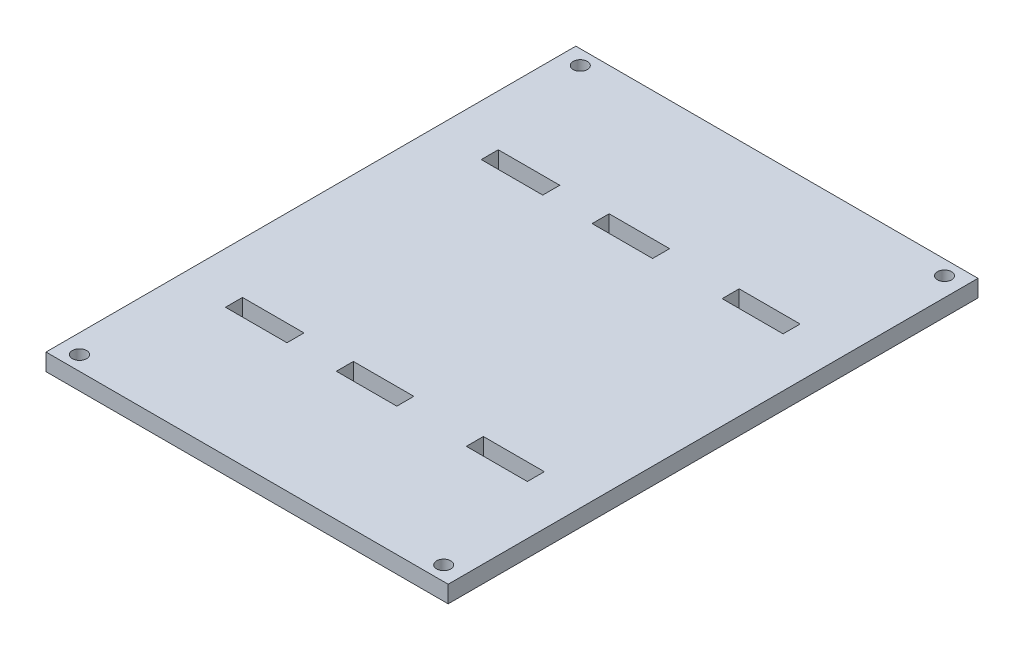
ISO-10303-21;
HEADER;
FILE_DESCRIPTION(('STEP AP214'),'2;1');
FILE_NAME('part.step','',(''),(''),'','','');
FILE_SCHEMA(('AUTOMOTIVE_DESIGN { 1 0 10303 214 1 1 1 1 }'));
ENDSEC;
DATA;
#1=APPLICATION_CONTEXT('core data for automotive mechanical design processes');
#2=APPLICATION_PROTOCOL_DEFINITION('international standard','automotive_design',2000,#1);
#3=PRODUCT_CONTEXT('',#1,'mechanical');
#4=PRODUCT('Part','Part','',(#3));
#5=PRODUCT_RELATED_PRODUCT_CATEGORY('part','',(#4));
#6=PRODUCT_DEFINITION_FORMATION('','',#4);
#7=PRODUCT_DEFINITION_CONTEXT('part definition',#1,'design');
#8=PRODUCT_DEFINITION('design','',#6,#7);
#9=PRODUCT_DEFINITION_SHAPE('','',#8);
#10=(LENGTH_UNIT() NAMED_UNIT(*) SI_UNIT(.MILLI.,.METRE.));
#11=(NAMED_UNIT(*) PLANE_ANGLE_UNIT() SI_UNIT($,.RADIAN.));
#12=(NAMED_UNIT(*) SI_UNIT($,.STERADIAN.) SOLID_ANGLE_UNIT());
#13=UNCERTAINTY_MEASURE_WITH_UNIT(LENGTH_MEASURE(1.E-05),#10,'distance_accuracy_value','');
#14=(GEOMETRIC_REPRESENTATION_CONTEXT(3) GLOBAL_UNCERTAINTY_ASSIGNED_CONTEXT((#13)) GLOBAL_UNIT_ASSIGNED_CONTEXT((#10,
#11,#12)) REPRESENTATION_CONTEXT('',''));
#15=CARTESIAN_POINT('',(0.,0.,0.));
#16=DIRECTION('',(0.,0.,1.));
#17=DIRECTION('',(1.,0.,0.));
#18=AXIS2_PLACEMENT_3D('',#15,#16,#17);
#19=CARTESIAN_POINT('',(-24.0222123847279,5.334,38.6699028632195));
#20=DIRECTION('',(1.,0.,0.));
#21=DIRECTION('',(0.,0.,-1.));
#22=AXIS2_PLACEMENT_3D('',#19,#20,#21);
#23=PLANE('',#22);
#24=DIRECTION('',(0.,0.,1.));
#25=VECTOR('',#24,1.);
#26=CARTESIAN_POINT('',(-24.0222123847279,0.,38.6699028632195));
#27=LINE('',#26,#25);
#28=CARTESIAN_POINT('',(-24.0222123847279,0.,-127.33009711478));
#29=VERTEX_POINT('',#28);
#30=CARTESIAN_POINT('',(-24.0222123847279,0.,38.6699028632195));
#31=VERTEX_POINT('',#30);
#32=EDGE_CURVE('E414',#29,#31,#27,.T.);
#33=ORIENTED_EDGE('',*,*,#32,.T.);
#34=DIRECTION('',(0.,-1.,0.));
#35=VECTOR('',#34,1.);
#36=CARTESIAN_POINT('',(-24.0222123847279,5.334,38.6699028632195));
#37=LINE('',#36,#35);
#38=CARTESIAN_POINT('',(-24.0222123847279,5.334,38.6699028632195));
#39=VERTEX_POINT('',#38);
#40=EDGE_CURVE('E11',#39,#31,#37,.T.);
#41=ORIENTED_EDGE('',*,*,#40,.F.);
#42=DIRECTION('',(0.,0.,1.));
#43=VECTOR('',#42,1.);
#44=CARTESIAN_POINT('',(-24.0222123847279,5.334,38.6699028632195));
#45=LINE('',#44,#43);
#46=CARTESIAN_POINT('',(-24.0222123847279,5.334,-127.33009711478));
#47=VERTEX_POINT('',#46);
#48=EDGE_CURVE('E421',#47,#39,#45,.T.);
#49=ORIENTED_EDGE('',*,*,#48,.F.);
#50=DIRECTION('',(0.,-1.,0.));
#51=VECTOR('',#50,1.);
#52=CARTESIAN_POINT('',(-24.0222123847279,5.334,-127.33009711478));
#53=LINE('',#52,#51);
#54=EDGE_CURVE('E431',#47,#29,#53,.T.);
#55=ORIENTED_EDGE('',*,*,#54,.T.);
#56=EDGE_LOOP('',(#33,#41,#49,#55));
#57=FACE_BOUND('',#56,.T.);
#58=ADVANCED_FACE('F38',(#57),#23,.F.);
#59=CARTESIAN_POINT('',(-24.0222123847279,5.334,38.6699028632195));
#60=DIRECTION('',(0.,0.,-1.));
#61=DIRECTION('',(-1.,0.,0.));
#62=AXIS2_PLACEMENT_3D('',#59,#60,#61);
#63=PLANE('',#62);
#64=DIRECTION('',(1.,0.,0.));
#65=VECTOR('',#64,1.);
#66=CARTESIAN_POINT('',(-24.0222123847279,0.,38.6699028632195));
#67=LINE('',#66,#65);
#68=CARTESIAN_POINT('',(101.977787583272,0.,38.6699028632195));
#69=VERTEX_POINT('',#68);
#70=EDGE_CURVE('E434',#31,#69,#67,.T.);
#71=ORIENTED_EDGE('',*,*,#70,.T.);
#72=DIRECTION('',(0.,-1.,0.));
#73=VECTOR('',#72,1.);
#74=CARTESIAN_POINT('',(101.977787583272,5.334,38.6699028632195));
#75=LINE('',#74,#73);
#76=CARTESIAN_POINT('',(101.977787583272,5.334,38.6699028632195));
#77=VERTEX_POINT('',#76);
#78=EDGE_CURVE('E45',#77,#69,#75,.T.);
#79=ORIENTED_EDGE('',*,*,#78,.F.);
#80=DIRECTION('',(1.,0.,0.));
#81=VECTOR('',#80,1.);
#82=CARTESIAN_POINT('',(-24.0222123847279,5.334,38.6699028632195));
#83=LINE('',#82,#81);
#84=EDGE_CURVE('E424',#39,#77,#83,.T.);
#85=ORIENTED_EDGE('',*,*,#84,.F.);
#86=ORIENTED_EDGE('',*,*,#40,.T.);
#87=EDGE_LOOP('',(#71,#79,#85,#86));
#88=FACE_BOUND('',#87,.T.);
#89=ADVANCED_FACE('F463',(#88),#63,.F.);
#90=CARTESIAN_POINT('',(101.977787583272,5.334,38.6699028632195));
#91=DIRECTION('',(-1.,0.,0.));
#92=DIRECTION('',(0.,0.,1.));
#93=AXIS2_PLACEMENT_3D('',#90,#91,#92);
#94=PLANE('',#93);
#95=DIRECTION('',(0.,0.,-1.));
#96=VECTOR('',#95,1.);
#97=CARTESIAN_POINT('',(101.977787583272,0.,38.6699028632195));
#98=LINE('',#97,#96);
#99=CARTESIAN_POINT('',(101.977787583272,0.,-127.33009711478));
#100=VERTEX_POINT('',#99);
#101=EDGE_CURVE('E436',#69,#100,#98,.T.);
#102=ORIENTED_EDGE('',*,*,#101,.T.);
#103=DIRECTION('',(0.,-1.,0.));
#104=VECTOR('',#103,1.);
#105=CARTESIAN_POINT('',(101.977787583272,5.334,-127.33009711478));
#106=LINE('',#105,#104);
#107=CARTESIAN_POINT('',(101.977787583272,5.334,-127.33009711478));
#108=VERTEX_POINT('',#107);
#109=EDGE_CURVE('E441',#108,#100,#106,.T.);
#110=ORIENTED_EDGE('',*,*,#109,.F.);
#111=DIRECTION('',(0.,0.,-1.));
#112=VECTOR('',#111,1.);
#113=CARTESIAN_POINT('',(101.977787583272,5.334,38.6699028632195));
#114=LINE('',#113,#112);
#115=EDGE_CURVE('E427',#77,#108,#114,.T.);
#116=ORIENTED_EDGE('',*,*,#115,.F.);
#117=ORIENTED_EDGE('',*,*,#78,.T.);
#118=EDGE_LOOP('',(#102,#110,#116,#117));
#119=FACE_BOUND('',#118,.T.);
#120=ADVANCED_FACE('F448',(#119),#94,.F.);
#121=CARTESIAN_POINT('',(-24.0222123847279,5.334,-127.33009711478));
#122=DIRECTION('',(0.,0.,1.));
#123=DIRECTION('',(1.,0.,0.));
#124=AXIS2_PLACEMENT_3D('',#121,#122,#123);
#125=PLANE('',#124);
#126=DIRECTION('',(-1.,0.,0.));
#127=VECTOR('',#126,1.);
#128=CARTESIAN_POINT('',(-24.0222123847279,0.,-127.33009711478));
#129=LINE('',#128,#127);
#130=EDGE_CURVE('E425',#100,#29,#129,.T.);
#131=ORIENTED_EDGE('',*,*,#130,.T.);
#132=ORIENTED_EDGE('',*,*,#54,.F.);
#133=DIRECTION('',(-1.,0.,0.));
#134=VECTOR('',#133,1.);
#135=CARTESIAN_POINT('',(-24.0222123847279,5.334,-127.33009711478));
#136=LINE('',#135,#134);
#137=EDGE_CURVE('E429',#108,#47,#136,.T.);
#138=ORIENTED_EDGE('',*,*,#137,.F.);
#139=ORIENTED_EDGE('',*,*,#109,.T.);
#140=EDGE_LOOP('',(#131,#132,#138,#139));
#141=FACE_BOUND('',#140,.T.);
#142=ADVANCED_FACE('F456',(#141),#125,.F.);
#143=CARTESIAN_POINT('',(0.,5.334,0.));
#144=DIRECTION('',(0.,-1.,0.));
#145=DIRECTION('',(0.,0.,-1.));
#146=AXIS2_PLACEMENT_3D('',#143,#144,#145);
#147=PLANE('',#146);
#148=CARTESIAN_POINT('',(-18.0797124007289,5.334,34.1199028742194));
#149=DIRECTION('',(0.,1.,0.));
#150=DIRECTION('',(0.,0.,1.));
#151=AXIS2_PLACEMENT_3D('',#148,#149,#150);
#152=CIRCLE('',#151,2.23969525238669);
#153=CARTESIAN_POINT('',(-18.0797124007289,5.334,36.3595981266061));
#154=VERTEX_POINT('',#153);
#155=EDGE_CURVE('E606',#154,#154,#152,.T.);
#156=ORIENTED_EDGE('',*,*,#155,.F.);
#157=EDGE_LOOP('',(#156));
#158=FACE_BOUND('',#157,.T.);
#159=CARTESIAN_POINT('',(-18.0797124007291,5.334,-122.780097125781));
#160=DIRECTION('',(0.,1.,0.));
#161=DIRECTION('',(0.,0.,1.));
#162=AXIS2_PLACEMENT_3D('',#159,#160,#161);
#163=CIRCLE('',#162,2.22340927148664);
#164=CARTESIAN_POINT('',(-18.0797124007291,5.334,-120.556687854294));
#165=VERTEX_POINT('',#164);
#166=EDGE_CURVE('E598',#165,#165,#163,.T.);
#167=ORIENTED_EDGE('',*,*,#166,.F.);
#168=EDGE_LOOP('',(#167));
#169=FACE_BOUND('',#168,.T.);
#170=CARTESIAN_POINT('',(96.0352875992709,5.334,-122.780097125781));
#171=DIRECTION('',(0.,1.,0.));
#172=DIRECTION('',(0.,0.,1.));
#173=AXIS2_PLACEMENT_3D('',#170,#171,#172);
#174=CIRCLE('',#173,2.22221239567424);
#175=CARTESIAN_POINT('',(96.0352875992709,5.334,-120.557884730107));
#176=VERTEX_POINT('',#175);
#177=EDGE_CURVE('E592',#176,#176,#174,.T.);
#178=ORIENTED_EDGE('',*,*,#177,.F.);
#179=EDGE_LOOP('',(#178));
#180=FACE_BOUND('',#179,.T.);
#181=CARTESIAN_POINT('',(96.035287599271,5.334,34.1199028742192));
#182=DIRECTION('',(0.,1.,0.));
#183=DIRECTION('',(0.,0.,1.));
#184=AXIS2_PLACEMENT_3D('',#181,#182,#183);
#185=CIRCLE('',#184,2.22352125676703);
#186=CARTESIAN_POINT('',(96.035287599271,5.334,36.3434241309863));
#187=VERTEX_POINT('',#186);
#188=EDGE_CURVE('E252',#187,#187,#185,.T.);
#189=ORIENTED_EDGE('',*,*,#188,.F.);
#190=EDGE_LOOP('',(#189));
#191=FACE_BOUND('',#190,.T.);
#192=DIRECTION('',(0.,0.,-1.));
#193=VECTOR('',#192,1.);
#194=CARTESIAN_POINT('',(11.2104078582131,5.334,0.));
#195=LINE('',#194,#193);
#196=CARTESIAN_POINT('',(11.2104078582133,5.334,-81.7311718127627));
#197=VERTEX_POINT('',#196);
#198=CARTESIAN_POINT('',(11.2104078582133,5.334,-87.0651718127626));
#199=VERTEX_POINT('',#198);
#200=EDGE_CURVE('E283',#197,#199,#195,.T.);
#201=ORIENTED_EDGE('',*,*,#200,.F.);
#202=DIRECTION('',(1.,0.,0.));
#203=VECTOR('',#202,1.);
#204=CARTESIAN_POINT('',(0.,5.334,-81.7311718127627));
#205=LINE('',#204,#203);
#206=CARTESIAN_POINT('',(-8.05963906893386,5.334,-81.7311718127627));
#207=VERTEX_POINT('',#206);
#208=EDGE_CURVE('E52',#207,#197,#205,.T.);
#209=ORIENTED_EDGE('',*,*,#208,.F.);
#210=DIRECTION('',(0.,0.,-1.));
#211=VECTOR('',#210,1.);
#212=CARTESIAN_POINT('',(-8.05963906893392,5.334,0.));
#213=LINE('',#212,#211);
#214=CARTESIAN_POINT('',(-8.05963906893386,5.334,-87.0651718127627));
#215=VERTEX_POINT('',#214);
#216=EDGE_CURVE('E273',#207,#215,#213,.T.);
#217=ORIENTED_EDGE('',*,*,#216,.T.);
#218=DIRECTION('',(-1.,0.,0.));
#219=VECTOR('',#218,1.);
#220=CARTESIAN_POINT('',(0.,5.334,-87.0651718127627));
#221=LINE('',#220,#219);
#222=EDGE_CURVE('E287',#199,#215,#221,.T.);
#223=ORIENTED_EDGE('',*,*,#222,.F.);
#224=EDGE_LOOP('',(#201,#209,#217,#223));
#225=FACE_BOUND('',#224,.T.);
#226=DIRECTION('',(0.,0.,-1.));
#227=VECTOR('',#226,1.);
#228=CARTESIAN_POINT('',(45.6211664280755,5.334,0.));
#229=LINE('',#228,#227);
#230=CARTESIAN_POINT('',(45.6211664280756,5.334,-81.7311718127626));
#231=VERTEX_POINT('',#230);
#232=CARTESIAN_POINT('',(45.6211664280756,5.334,-87.0651718127626));
#233=VERTEX_POINT('',#232);
#234=EDGE_CURVE('E314',#231,#233,#229,.T.);
#235=ORIENTED_EDGE('',*,*,#234,.F.);
#236=DIRECTION('',(1.,0.,0.));
#237=VECTOR('',#236,1.);
#238=CARTESIAN_POINT('',(0.,5.334,-81.7311718127626));
#239=LINE('',#238,#237);
#240=CARTESIAN_POINT('',(26.6749997820723,5.334,-81.7311718127626));
#241=VERTEX_POINT('',#240);
#242=EDGE_CURVE('E60',#241,#231,#239,.T.);
#243=ORIENTED_EDGE('',*,*,#242,.F.);
#244=DIRECTION('',(0.,0.,-1.));
#245=VECTOR('',#244,1.);
#246=CARTESIAN_POINT('',(26.6749997820722,5.334,0.));
#247=LINE('',#246,#245);
#248=CARTESIAN_POINT('',(26.6749997820723,5.334,-87.0651718127626));
#249=VERTEX_POINT('',#248);
#250=EDGE_CURVE('E304',#241,#249,#247,.T.);
#251=ORIENTED_EDGE('',*,*,#250,.T.);
#252=DIRECTION('',(-1.,0.,0.));
#253=VECTOR('',#252,1.);
#254=CARTESIAN_POINT('',(0.,5.334,-87.0651718127626));
#255=LINE('',#254,#253);
#256=EDGE_CURVE('E318',#233,#249,#255,.T.);
#257=ORIENTED_EDGE('',*,*,#256,.F.);
#258=EDGE_LOOP('',(#235,#243,#251,#257));
#259=FACE_BOUND('',#258,.T.);
#260=DIRECTION('',(0.,0.,-1.));
#261=VECTOR('',#260,1.);
#262=CARTESIAN_POINT('',(86.5133094390257,5.334,0.));
#263=LINE('',#262,#261);
#264=CARTESIAN_POINT('',(86.5133094390257,5.334,-81.7311718127626));
#265=VERTEX_POINT('',#264);
#266=CARTESIAN_POINT('',(86.5133094390257,5.334,-87.0651718127626));
#267=VERTEX_POINT('',#266);
#268=EDGE_CURVE('E344',#265,#267,#263,.T.);
#269=ORIENTED_EDGE('',*,*,#268,.F.);
#270=DIRECTION('',(1.,0.,0.));
#271=VECTOR('',#270,1.);
#272=CARTESIAN_POINT('',(1.18744222138608E-13,5.334,-81.7311718127627));
#273=LINE('',#272,#271);
#274=CARTESIAN_POINT('',(67.4092580709084,5.334,-81.7311718127626));
#275=VERTEX_POINT('',#274);
#276=EDGE_CURVE('E342',#275,#265,#273,.T.);
#277=ORIENTED_EDGE('',*,*,#276,.F.);
#278=DIRECTION('',(0.,0.,-1.));
#279=VECTOR('',#278,1.);
#280=CARTESIAN_POINT('',(67.4092580709084,5.334,0.));
#281=LINE('',#280,#279);
#282=CARTESIAN_POINT('',(67.4092580709084,5.334,-87.0651718127626));
#283=VERTEX_POINT('',#282);
#284=EDGE_CURVE('E333',#275,#283,#281,.T.);
#285=ORIENTED_EDGE('',*,*,#284,.T.);
#286=DIRECTION('',(-1.,0.,0.));
#287=VECTOR('',#286,1.);
#288=CARTESIAN_POINT('',(0.,5.334,-87.0651718127626));
#289=LINE('',#288,#287);
#290=EDGE_CURVE('E348',#267,#283,#289,.T.);
#291=ORIENTED_EDGE('',*,*,#290,.F.);
#292=EDGE_LOOP('',(#269,#277,#285,#291));
#293=FACE_BOUND('',#292,.T.);
#294=DIRECTION('',(0.,0.,-1.));
#295=VECTOR('',#294,1.);
#296=CARTESIAN_POINT('',(86.5133094390238,5.334,6.75260602332151E-13));
#297=LINE('',#296,#295);
#298=CARTESIAN_POINT('',(86.5133094390238,5.334,-1.59502243879831));
#299=VERTEX_POINT('',#298);
#300=CARTESIAN_POINT('',(86.5133094390239,5.334,-6.92902243879831));
#301=VERTEX_POINT('',#300);
#302=EDGE_CURVE('E374',#299,#301,#297,.T.);
#303=ORIENTED_EDGE('',*,*,#302,.F.);
#304=DIRECTION('',(1.,0.,0.));
#305=VECTOR('',#304,1.);
#306=CARTESIAN_POINT('',(0.,5.334,-1.59502243879892));
#307=LINE('',#306,#305);
#308=CARTESIAN_POINT('',(67.4092580709065,5.334,-1.59502243879844));
#309=VERTEX_POINT('',#308);
#310=EDGE_CURVE('E265',#309,#299,#307,.T.);
#311=ORIENTED_EDGE('',*,*,#310,.F.);
#312=DIRECTION('',(0.,0.,-1.));
#313=VECTOR('',#312,1.);
#314=CARTESIAN_POINT('',(67.4092580709065,5.334,3.50765421743624E-13));
#315=LINE('',#314,#313);
#316=CARTESIAN_POINT('',(67.4092580709065,5.334,-6.92902243879844));
#317=VERTEX_POINT('',#316);
#318=EDGE_CURVE('E364',#309,#317,#315,.T.);
#319=ORIENTED_EDGE('',*,*,#318,.T.);
#320=DIRECTION('',(-1.,0.,0.));
#321=VECTOR('',#320,1.);
#322=CARTESIAN_POINT('',(0.,5.334,-6.92902243879891));
#323=LINE('',#322,#321);
#324=EDGE_CURVE('E377',#301,#317,#323,.T.);
#325=ORIENTED_EDGE('',*,*,#324,.F.);
#326=EDGE_LOOP('',(#303,#311,#319,#325));
#327=FACE_BOUND('',#326,.T.);
#328=DIRECTION('',(0.,0.,-1.));
#329=VECTOR('',#328,1.);
#330=CARTESIAN_POINT('',(45.6211664280737,5.334,2.96738314226563E-13));
#331=LINE('',#330,#329);
#332=CARTESIAN_POINT('',(45.6211664280737,5.334,-1.5950224387986));
#333=VERTEX_POINT('',#332);
#334=CARTESIAN_POINT('',(45.6211664280737,5.334,-6.9290224387986));
#335=VERTEX_POINT('',#334);
#336=EDGE_CURVE('E258',#333,#335,#331,.T.);
#337=ORIENTED_EDGE('',*,*,#336,.F.);
#338=DIRECTION('',(1.,0.,0.));
#339=VECTOR('',#338,1.);
#340=CARTESIAN_POINT('',(0.,5.334,-1.59502243879892));
#341=LINE('',#340,#339);
#342=CARTESIAN_POINT('',(26.6749997820704,5.334,-1.59502243879873));
#343=VERTEX_POINT('',#342);
#344=EDGE_CURVE('E229',#343,#333,#341,.T.);
#345=ORIENTED_EDGE('',*,*,#344,.F.);
#346=DIRECTION('',(0.,0.,-1.));
#347=VECTOR('',#346,1.);
#348=CARTESIAN_POINT('',(26.6749997820703,5.334,1.90855354998114E-13));
#349=LINE('',#348,#347);
#350=CARTESIAN_POINT('',(26.6749997820704,5.334,-6.92902243879873));
#351=VERTEX_POINT('',#350);
#352=EDGE_CURVE('E246',#343,#351,#349,.T.);
#353=ORIENTED_EDGE('',*,*,#352,.T.);
#354=DIRECTION('',(-1.,0.,0.));
#355=VECTOR('',#354,1.);
#356=CARTESIAN_POINT('',(0.,5.334,-6.92902243879891));
#357=LINE('',#356,#355);
#358=EDGE_CURVE('E249',#335,#351,#357,.T.);
#359=ORIENTED_EDGE('',*,*,#358,.F.);
#360=EDGE_LOOP('',(#337,#345,#353,#359));
#361=FACE_BOUND('',#360,.T.);
#362=DIRECTION('',(-1.,0.,0.));
#363=VECTOR('',#362,1.);
#364=CARTESIAN_POINT('',(0.,5.334,-6.92902243879891));
#365=LINE('',#364,#363);
#366=CARTESIAN_POINT('',(11.2104078582114,5.334,-6.92902243879884));
#367=VERTEX_POINT('',#366);
#368=CARTESIAN_POINT('',(-8.05963906893575,5.334,-6.92902243879897));
#369=VERTEX_POINT('',#368);
#370=EDGE_CURVE('E404',#367,#369,#365,.T.);
#371=ORIENTED_EDGE('',*,*,#370,.F.);
#372=DIRECTION('',(0.,0.,-1.));
#373=VECTOR('',#372,1.);
#374=CARTESIAN_POINT('',(11.2104078582114,5.334,0.));
#375=LINE('',#374,#373);
#376=CARTESIAN_POINT('',(11.2104078582114,5.334,-1.59502243879884));
#377=VERTEX_POINT('',#376);
#378=EDGE_CURVE('E294',#377,#367,#375,.T.);
#379=ORIENTED_EDGE('',*,*,#378,.F.);
#380=DIRECTION('',(1.,0.,0.));
#381=VECTOR('',#380,1.);
#382=CARTESIAN_POINT('',(0.,5.334,-1.59502243879891));
#383=LINE('',#382,#381);
#384=CARTESIAN_POINT('',(-8.05963906893578,5.334,-1.59502243879897));
#385=VERTEX_POINT('',#384);
#386=EDGE_CURVE('E393',#385,#377,#383,.T.);
#387=ORIENTED_EDGE('',*,*,#386,.F.);
#388=DIRECTION('',(0.,0.,1.));
#389=VECTOR('',#388,1.);
#390=CARTESIAN_POINT('',(-8.0596390689358,5.334,0.));
#391=LINE('',#390,#389);
#392=EDGE_CURVE('E407',#369,#385,#391,.T.);
#393=ORIENTED_EDGE('',*,*,#392,.F.);
#394=EDGE_LOOP('',(#371,#379,#387,#393));
#395=FACE_BOUND('',#394,.T.);
#396=ORIENTED_EDGE('',*,*,#48,.T.);
#397=ORIENTED_EDGE('',*,*,#84,.T.);
#398=ORIENTED_EDGE('',*,*,#115,.T.);
#399=ORIENTED_EDGE('',*,*,#137,.T.);
#400=EDGE_LOOP('',(#396,#397,#398,#399));
#401=FACE_BOUND('',#400,.T.);
#402=ADVANCED_FACE('F462',(#158,#169,#180,#191,#225,#259,#293,#327,#361,#395,#401),#147,.F.);
#403=CARTESIAN_POINT('',(0.,0.,0.));
#404=DIRECTION('',(0.,-1.,0.));
#405=DIRECTION('',(0.,0.,-1.));
#406=AXIS2_PLACEMENT_3D('',#403,#404,#405);
#407=PLANE('',#406);
#408=CARTESIAN_POINT('',(-18.0797124007289,0.,34.1199028742194));
#409=DIRECTION('',(0.,1.,0.));
#410=DIRECTION('',(0.,0.,1.));
#411=AXIS2_PLACEMENT_3D('',#408,#409,#410);
#412=CIRCLE('',#411,2.23969525238669);
#413=CARTESIAN_POINT('',(-18.0797124007289,0.,36.3595981266061));
#414=VERTEX_POINT('',#413);
#415=EDGE_CURVE('E603',#414,#414,#412,.T.);
#416=ORIENTED_EDGE('',*,*,#415,.T.);
#417=EDGE_LOOP('',(#416));
#418=FACE_BOUND('',#417,.T.);
#419=CARTESIAN_POINT('',(-18.0797124007291,0.,-122.780097125781));
#420=DIRECTION('',(0.,1.,0.));
#421=DIRECTION('',(0.,0.,1.));
#422=AXIS2_PLACEMENT_3D('',#419,#420,#421);
#423=CIRCLE('',#422,2.22340927148664);
#424=CARTESIAN_POINT('',(-18.0797124007291,0.,-120.556687854294));
#425=VERTEX_POINT('',#424);
#426=EDGE_CURVE('E594',#425,#425,#423,.T.);
#427=ORIENTED_EDGE('',*,*,#426,.T.);
#428=EDGE_LOOP('',(#427));
#429=FACE_BOUND('',#428,.T.);
#430=CARTESIAN_POINT('',(96.0352875992709,0.,-122.780097125781));
#431=DIRECTION('',(0.,1.,0.));
#432=DIRECTION('',(0.,0.,1.));
#433=AXIS2_PLACEMENT_3D('',#430,#431,#432);
#434=CIRCLE('',#433,2.22221239567424);
#435=CARTESIAN_POINT('',(96.0352875992709,0.,-120.557884730107));
#436=VERTEX_POINT('',#435);
#437=EDGE_CURVE('E589',#436,#436,#434,.T.);
#438=ORIENTED_EDGE('',*,*,#437,.T.);
#439=EDGE_LOOP('',(#438));
#440=FACE_BOUND('',#439,.T.);
#441=CARTESIAN_POINT('',(96.035287599271,0.,34.1199028742192));
#442=DIRECTION('',(0.,1.,0.));
#443=DIRECTION('',(0.,0.,1.));
#444=AXIS2_PLACEMENT_3D('',#441,#442,#443);
#445=CIRCLE('',#444,2.22352125676703);
#446=CARTESIAN_POINT('',(96.035287599271,0.,36.3434241309863));
#447=VERTEX_POINT('',#446);
#448=EDGE_CURVE('E259',#447,#447,#445,.T.);
#449=ORIENTED_EDGE('',*,*,#448,.T.);
#450=EDGE_LOOP('',(#449));
#451=FACE_BOUND('',#450,.T.);
#452=DIRECTION('',(1.,0.,0.));
#453=VECTOR('',#452,1.);
#454=CARTESIAN_POINT('',(0.,0.,-81.7311718127627));
#455=LINE('',#454,#453);
#456=CARTESIAN_POINT('',(-8.05963906893386,0.,-81.7311718127627));
#457=VERTEX_POINT('',#456);
#458=CARTESIAN_POINT('',(11.2104078582133,0.,-81.7311718127627));
#459=VERTEX_POINT('',#458);
#460=EDGE_CURVE('E269',#457,#459,#455,.T.);
#461=ORIENTED_EDGE('',*,*,#460,.T.);
#462=DIRECTION('',(0.,0.,-1.));
#463=VECTOR('',#462,1.);
#464=CARTESIAN_POINT('',(11.2104078582131,0.,0.));
#465=LINE('',#464,#463);
#466=CARTESIAN_POINT('',(11.2104078582133,0.,-87.0651718127626));
#467=VERTEX_POINT('',#466);
#468=EDGE_CURVE('E272',#459,#467,#465,.T.);
#469=ORIENTED_EDGE('',*,*,#468,.T.);
#470=DIRECTION('',(-1.,0.,0.));
#471=VECTOR('',#470,1.);
#472=CARTESIAN_POINT('',(0.,0.,-87.0651718127627));
#473=LINE('',#472,#471);
#474=CARTESIAN_POINT('',(-8.05963906893386,0.,-87.0651718127627));
#475=VERTEX_POINT('',#474);
#476=EDGE_CURVE('E276',#467,#475,#473,.T.);
#477=ORIENTED_EDGE('',*,*,#476,.T.);
#478=DIRECTION('',(0.,0.,-1.));
#479=VECTOR('',#478,1.);
#480=CARTESIAN_POINT('',(-8.05963906893392,0.,0.));
#481=LINE('',#480,#479);
#482=EDGE_CURVE('E279',#457,#475,#481,.T.);
#483=ORIENTED_EDGE('',*,*,#482,.F.);
#484=EDGE_LOOP('',(#461,#469,#477,#483));
#485=FACE_BOUND('',#484,.T.);
#486=DIRECTION('',(1.,0.,0.));
#487=VECTOR('',#486,1.);
#488=CARTESIAN_POINT('',(0.,0.,-81.7311718127626));
#489=LINE('',#488,#487);
#490=CARTESIAN_POINT('',(26.6749997820723,0.,-81.7311718127626));
#491=VERTEX_POINT('',#490);
#492=CARTESIAN_POINT('',(45.6211664280756,0.,-81.7311718127626));
#493=VERTEX_POINT('',#492);
#494=EDGE_CURVE('E300',#491,#493,#489,.T.);
#495=ORIENTED_EDGE('',*,*,#494,.T.);
#496=DIRECTION('',(0.,0.,-1.));
#497=VECTOR('',#496,1.);
#498=CARTESIAN_POINT('',(45.6211664280755,0.,0.));
#499=LINE('',#498,#497);
#500=CARTESIAN_POINT('',(45.6211664280756,0.,-87.0651718127626));
#501=VERTEX_POINT('',#500);
#502=EDGE_CURVE('E303',#493,#501,#499,.T.);
#503=ORIENTED_EDGE('',*,*,#502,.T.);
#504=DIRECTION('',(-1.,0.,0.));
#505=VECTOR('',#504,1.);
#506=CARTESIAN_POINT('',(0.,0.,-87.0651718127626));
#507=LINE('',#506,#505);
#508=CARTESIAN_POINT('',(26.6749997820723,0.,-87.0651718127626));
#509=VERTEX_POINT('',#508);
#510=EDGE_CURVE('E307',#501,#509,#507,.T.);
#511=ORIENTED_EDGE('',*,*,#510,.T.);
#512=DIRECTION('',(0.,0.,-1.));
#513=VECTOR('',#512,1.);
#514=CARTESIAN_POINT('',(26.6749997820722,0.,0.));
#515=LINE('',#514,#513);
#516=EDGE_CURVE('E310',#491,#509,#515,.T.);
#517=ORIENTED_EDGE('',*,*,#516,.F.);
#518=EDGE_LOOP('',(#495,#503,#511,#517));
#519=FACE_BOUND('',#518,.T.);
#520=DIRECTION('',(1.,0.,0.));
#521=VECTOR('',#520,1.);
#522=CARTESIAN_POINT('',(1.18744222138608E-13,0.,-81.7311718127627));
#523=LINE('',#522,#521);
#524=CARTESIAN_POINT('',(67.4092580709084,0.,-81.7311718127626));
#525=VERTEX_POINT('',#524);
#526=CARTESIAN_POINT('',(86.5133094390257,0.,-81.7311718127626));
#527=VERTEX_POINT('',#526);
#528=EDGE_CURVE('E329',#525,#527,#523,.T.);
#529=ORIENTED_EDGE('',*,*,#528,.T.);
#530=DIRECTION('',(0.,0.,-1.));
#531=VECTOR('',#530,1.);
#532=CARTESIAN_POINT('',(86.5133094390257,0.,0.));
#533=LINE('',#532,#531);
#534=CARTESIAN_POINT('',(86.5133094390257,0.,-87.0651718127626));
#535=VERTEX_POINT('',#534);
#536=EDGE_CURVE('E332',#527,#535,#533,.T.);
#537=ORIENTED_EDGE('',*,*,#536,.T.);
#538=DIRECTION('',(-1.,0.,0.));
#539=VECTOR('',#538,1.);
#540=CARTESIAN_POINT('',(0.,0.,-87.0651718127626));
#541=LINE('',#540,#539);
#542=CARTESIAN_POINT('',(67.4092580709084,0.,-87.0651718127626));
#543=VERTEX_POINT('',#542);
#544=EDGE_CURVE('E336',#535,#543,#541,.T.);
#545=ORIENTED_EDGE('',*,*,#544,.T.);
#546=DIRECTION('',(0.,0.,-1.));
#547=VECTOR('',#546,1.);
#548=CARTESIAN_POINT('',(67.4092580709084,0.,0.));
#549=LINE('',#548,#547);
#550=EDGE_CURVE('E339',#525,#543,#549,.T.);
#551=ORIENTED_EDGE('',*,*,#550,.F.);
#552=EDGE_LOOP('',(#529,#537,#545,#551));
#553=FACE_BOUND('',#552,.T.);
#554=DIRECTION('',(1.,0.,0.));
#555=VECTOR('',#554,1.);
#556=CARTESIAN_POINT('',(0.,0.,-1.59502243879892));
#557=LINE('',#556,#555);
#558=CARTESIAN_POINT('',(67.4092580709065,0.,-1.59502243879844));
#559=VERTEX_POINT('',#558);
#560=CARTESIAN_POINT('',(86.5133094390238,0.,-1.59502243879831));
#561=VERTEX_POINT('',#560);
#562=EDGE_CURVE('E360',#559,#561,#557,.T.);
#563=ORIENTED_EDGE('',*,*,#562,.T.);
#564=DIRECTION('',(0.,0.,-1.));
#565=VECTOR('',#564,1.);
#566=CARTESIAN_POINT('',(86.5133094390238,0.,6.75260602332151E-13));
#567=LINE('',#566,#565);
#568=CARTESIAN_POINT('',(86.5133094390239,0.,-6.92902243879831));
#569=VERTEX_POINT('',#568);
#570=EDGE_CURVE('E363',#561,#569,#567,.T.);
#571=ORIENTED_EDGE('',*,*,#570,.T.);
#572=DIRECTION('',(-1.,0.,0.));
#573=VECTOR('',#572,1.);
#574=CARTESIAN_POINT('',(0.,0.,-6.92902243879891));
#575=LINE('',#574,#573);
#576=CARTESIAN_POINT('',(67.4092580709065,0.,-6.92902243879844));
#577=VERTEX_POINT('',#576);
#578=EDGE_CURVE('E367',#569,#577,#575,.T.);
#579=ORIENTED_EDGE('',*,*,#578,.T.);
#580=DIRECTION('',(0.,0.,-1.));
#581=VECTOR('',#580,1.);
#582=CARTESIAN_POINT('',(67.4092580709065,0.,3.50765421743624E-13));
#583=LINE('',#582,#581);
#584=EDGE_CURVE('E370',#559,#577,#583,.T.);
#585=ORIENTED_EDGE('',*,*,#584,.F.);
#586=EDGE_LOOP('',(#563,#571,#579,#585));
#587=FACE_BOUND('',#586,.T.);
#588=DIRECTION('',(1.,0.,0.));
#589=VECTOR('',#588,1.);
#590=CARTESIAN_POINT('',(0.,0.,-1.59502243879892));
#591=LINE('',#590,#589);
#592=CARTESIAN_POINT('',(26.6749997820704,0.,-1.59502243879873));
#593=VERTEX_POINT('',#592);
#594=CARTESIAN_POINT('',(45.6211664280737,0.,-1.5950224387986));
#595=VERTEX_POINT('',#594);
#596=EDGE_CURVE('E226',#593,#595,#591,.T.);
#597=ORIENTED_EDGE('',*,*,#596,.T.);
#598=DIRECTION('',(0.,0.,-1.));
#599=VECTOR('',#598,1.);
#600=CARTESIAN_POINT('',(45.6211664280737,0.,2.96738314226563E-13));
#601=LINE('',#600,#599);
#602=CARTESIAN_POINT('',(45.6211664280737,0.,-6.9290224387986));
#603=VERTEX_POINT('',#602);
#604=EDGE_CURVE('E238',#595,#603,#601,.T.);
#605=ORIENTED_EDGE('',*,*,#604,.T.);
#606=DIRECTION('',(-1.,0.,0.));
#607=VECTOR('',#606,1.);
#608=CARTESIAN_POINT('',(0.,0.,-6.92902243879891));
#609=LINE('',#608,#607);
#610=CARTESIAN_POINT('',(26.6749997820704,0.,-6.92902243879873));
#611=VERTEX_POINT('',#610);
#612=EDGE_CURVE('E242',#603,#611,#609,.T.);
#613=ORIENTED_EDGE('',*,*,#612,.T.);
#614=DIRECTION('',(0.,0.,-1.));
#615=VECTOR('',#614,1.);
#616=CARTESIAN_POINT('',(26.6749997820703,0.,1.90855354998114E-13));
#617=LINE('',#616,#615);
#618=EDGE_CURVE('E234',#593,#611,#617,.T.);
#619=ORIENTED_EDGE('',*,*,#618,.F.);
#620=EDGE_LOOP('',(#597,#605,#613,#619));
#621=FACE_BOUND('',#620,.T.);
#622=DIRECTION('',(0.,0.,-1.));
#623=VECTOR('',#622,1.);
#624=CARTESIAN_POINT('',(11.2104078582114,0.,0.));
#625=LINE('',#624,#623);
#626=CARTESIAN_POINT('',(11.2104078582114,0.,-1.59502243879884));
#627=VERTEX_POINT('',#626);
#628=CARTESIAN_POINT('',(11.2104078582114,0.,-6.92902243879884));
#629=VERTEX_POINT('',#628);
#630=EDGE_CURVE('E389',#627,#629,#625,.T.);
#631=ORIENTED_EDGE('',*,*,#630,.T.);
#632=DIRECTION('',(-1.,0.,0.));
#633=VECTOR('',#632,1.);
#634=CARTESIAN_POINT('',(0.,0.,-6.92902243879891));
#635=LINE('',#634,#633);
#636=CARTESIAN_POINT('',(-8.05963906893575,0.,-6.92902243879897));
#637=VERTEX_POINT('',#636);
#638=EDGE_CURVE('E392',#629,#637,#635,.T.);
#639=ORIENTED_EDGE('',*,*,#638,.T.);
#640=DIRECTION('',(0.,0.,1.));
#641=VECTOR('',#640,1.);
#642=CARTESIAN_POINT('',(-8.0596390689358,0.,0.));
#643=LINE('',#642,#641);
#644=CARTESIAN_POINT('',(-8.05963906893578,0.,-1.59502243879897));
#645=VERTEX_POINT('',#644);
#646=EDGE_CURVE('E396',#637,#645,#643,.T.);
#647=ORIENTED_EDGE('',*,*,#646,.T.);
#648=DIRECTION('',(1.,0.,0.));
#649=VECTOR('',#648,1.);
#650=CARTESIAN_POINT('',(0.,0.,-1.59502243879891));
#651=LINE('',#650,#649);
#652=EDGE_CURVE('E399',#645,#627,#651,.T.);
#653=ORIENTED_EDGE('',*,*,#652,.T.);
#654=EDGE_LOOP('',(#631,#639,#647,#653));
#655=FACE_BOUND('',#654,.T.);
#656=ORIENTED_EDGE('',*,*,#32,.F.);
#657=ORIENTED_EDGE('',*,*,#130,.F.);
#658=ORIENTED_EDGE('',*,*,#101,.F.);
#659=ORIENTED_EDGE('',*,*,#70,.F.);
#660=EDGE_LOOP('',(#656,#657,#658,#659));
#661=FACE_BOUND('',#660,.T.);
#662=ADVANCED_FACE('F244',(#418,#429,#440,#451,#485,#519,#553,#587,#621,#655,#661),#407,.T.);
#663=CARTESIAN_POINT('',(11.2104078582114,0.,0.));
#664=DIRECTION('',(1.,0.,0.));
#665=DIRECTION('',(0.,0.,-1.));
#666=AXIS2_PLACEMENT_3D('',#663,#664,#665);
#667=PLANE('',#666);
#668=ORIENTED_EDGE('',*,*,#378,.T.);
#669=DIRECTION('',(0.,1.,0.));
#670=VECTOR('',#669,1.);
#671=CARTESIAN_POINT('',(11.2104078582114,0.,-6.92902243879884));
#672=LINE('',#671,#670);
#673=EDGE_CURVE('E402',#629,#367,#672,.T.);
#674=ORIENTED_EDGE('',*,*,#673,.F.);
#675=ORIENTED_EDGE('',*,*,#630,.F.);
#676=DIRECTION('',(0.,1.,0.));
#677=VECTOR('',#676,1.);
#678=CARTESIAN_POINT('',(11.2104078582114,0.,-1.59502243879884));
#679=LINE('',#678,#677);
#680=EDGE_CURVE('E412',#627,#377,#679,.T.);
#681=ORIENTED_EDGE('',*,*,#680,.T.);
#682=EDGE_LOOP('',(#668,#674,#675,#681));
#683=FACE_BOUND('',#682,.T.);
#684=ADVANCED_FACE('F475',(#683),#667,.F.);
#685=CARTESIAN_POINT('',(0.,0.,-1.59502243879891));
#686=DIRECTION('',(0.,0.,1.));
#687=DIRECTION('',(1.,0.,0.));
#688=AXIS2_PLACEMENT_3D('',#685,#686,#687);
#689=PLANE('',#688);
#690=ORIENTED_EDGE('',*,*,#386,.T.);
#691=ORIENTED_EDGE('',*,*,#680,.F.);
#692=ORIENTED_EDGE('',*,*,#652,.F.);
#693=DIRECTION('',(0.,1.,0.));
#694=VECTOR('',#693,1.);
#695=CARTESIAN_POINT('',(-8.05963906893578,0.,-1.59502243879897));
#696=LINE('',#695,#694);
#697=EDGE_CURVE('E415',#645,#385,#696,.T.);
#698=ORIENTED_EDGE('',*,*,#697,.T.);
#699=EDGE_LOOP('',(#690,#691,#692,#698));
#700=FACE_BOUND('',#699,.T.);
#701=ADVANCED_FACE('F482',(#700),#689,.F.);
#702=CARTESIAN_POINT('',(-8.0596390689358,0.,0.));
#703=DIRECTION('',(-1.,0.,0.));
#704=DIRECTION('',(0.,0.,1.));
#705=AXIS2_PLACEMENT_3D('',#702,#703,#704);
#706=PLANE('',#705);
#707=ORIENTED_EDGE('',*,*,#392,.T.);
#708=ORIENTED_EDGE('',*,*,#697,.F.);
#709=ORIENTED_EDGE('',*,*,#646,.F.);
#710=DIRECTION('',(0.,1.,0.));
#711=VECTOR('',#710,1.);
#712=CARTESIAN_POINT('',(-8.05963906893575,0.,-6.92902243879897));
#713=LINE('',#712,#711);
#714=EDGE_CURVE('E417',#637,#369,#713,.T.);
#715=ORIENTED_EDGE('',*,*,#714,.T.);
#716=EDGE_LOOP('',(#707,#708,#709,#715));
#717=FACE_BOUND('',#716,.T.);
#718=ADVANCED_FACE('F487',(#717),#706,.F.);
#719=CARTESIAN_POINT('',(0.,0.,-6.92902243879891));
#720=DIRECTION('',(0.,0.,-1.));
#721=DIRECTION('',(-1.,0.,0.));
#722=AXIS2_PLACEMENT_3D('',#719,#720,#721);
#723=PLANE('',#722);
#724=ORIENTED_EDGE('',*,*,#370,.T.);
#725=ORIENTED_EDGE('',*,*,#714,.F.);
#726=ORIENTED_EDGE('',*,*,#638,.F.);
#727=ORIENTED_EDGE('',*,*,#673,.T.);
#728=EDGE_LOOP('',(#724,#725,#726,#727));
#729=FACE_BOUND('',#728,.T.);
#730=ADVANCED_FACE('F484',(#729),#723,.F.);
#731=CARTESIAN_POINT('',(0.,0.,-1.59502243879892));
#732=DIRECTION('',(0.,0.,1.));
#733=DIRECTION('',(1.,0.,0.));
#734=AXIS2_PLACEMENT_3D('',#731,#732,#733);
#735=PLANE('',#734);
#736=ORIENTED_EDGE('',*,*,#344,.T.);
#737=DIRECTION('',(0.,1.,0.));
#738=VECTOR('',#737,1.);
#739=CARTESIAN_POINT('',(45.6211664280737,0.,-1.5950224387986));
#740=LINE('',#739,#738);
#741=EDGE_CURVE('E222',#595,#333,#740,.T.);
#742=ORIENTED_EDGE('',*,*,#741,.F.);
#743=ORIENTED_EDGE('',*,*,#596,.F.);
#744=DIRECTION('',(0.,1.,0.));
#745=VECTOR('',#744,1.);
#746=CARTESIAN_POINT('',(26.6749997820704,0.,-1.59502243879873));
#747=LINE('',#746,#745);
#748=EDGE_CURVE('E263',#593,#343,#747,.T.);
#749=ORIENTED_EDGE('',*,*,#748,.T.);
#750=EDGE_LOOP('',(#736,#742,#743,#749));
#751=FACE_BOUND('',#750,.T.);
#752=ADVANCED_FACE('F224',(#751),#735,.F.);
#753=CARTESIAN_POINT('',(26.6749997820703,0.,1.90855354998114E-13));
#754=DIRECTION('',(1.,0.,0.));
#755=DIRECTION('',(0.,0.,-1.));
#756=AXIS2_PLACEMENT_3D('',#753,#754,#755);
#757=PLANE('',#756);
#758=ORIENTED_EDGE('',*,*,#352,.F.);
#759=ORIENTED_EDGE('',*,*,#748,.F.);
#760=ORIENTED_EDGE('',*,*,#618,.T.);
#761=DIRECTION('',(0.,1.,0.));
#762=VECTOR('',#761,1.);
#763=CARTESIAN_POINT('',(26.6749997820704,0.,-6.92902243879873));
#764=LINE('',#763,#762);
#765=EDGE_CURVE('E266',#611,#351,#764,.T.);
#766=ORIENTED_EDGE('',*,*,#765,.T.);
#767=EDGE_LOOP('',(#758,#759,#760,#766));
#768=FACE_BOUND('',#767,.T.);
#769=ADVANCED_FACE('F560',(#768),#757,.T.);
#770=CARTESIAN_POINT('',(0.,0.,-6.92902243879891));
#771=DIRECTION('',(0.,0.,-1.));
#772=DIRECTION('',(-1.,0.,0.));
#773=AXIS2_PLACEMENT_3D('',#770,#771,#772);
#774=PLANE('',#773);
#775=ORIENTED_EDGE('',*,*,#358,.T.);
#776=ORIENTED_EDGE('',*,*,#765,.F.);
#777=ORIENTED_EDGE('',*,*,#612,.F.);
#778=DIRECTION('',(0.,1.,0.));
#779=VECTOR('',#778,1.);
#780=CARTESIAN_POINT('',(45.6211664280737,0.,-6.9290224387986));
#781=LINE('',#780,#779);
#782=EDGE_CURVE('E233',#603,#335,#781,.T.);
#783=ORIENTED_EDGE('',*,*,#782,.T.);
#784=EDGE_LOOP('',(#775,#776,#777,#783));
#785=FACE_BOUND('',#784,.T.);
#786=ADVANCED_FACE('F563',(#785),#774,.F.);
#787=CARTESIAN_POINT('',(45.6211664280737,0.,2.96738314226563E-13));
#788=DIRECTION('',(1.,0.,0.));
#789=DIRECTION('',(0.,0.,-1.));
#790=AXIS2_PLACEMENT_3D('',#787,#788,#789);
#791=PLANE('',#790);
#792=ORIENTED_EDGE('',*,*,#336,.T.);
#793=ORIENTED_EDGE('',*,*,#782,.F.);
#794=ORIENTED_EDGE('',*,*,#604,.F.);
#795=ORIENTED_EDGE('',*,*,#741,.T.);
#796=EDGE_LOOP('',(#792,#793,#794,#795));
#797=FACE_BOUND('',#796,.T.);
#798=ADVANCED_FACE('F239',(#797),#791,.F.);
#799=CARTESIAN_POINT('',(0.,0.,-1.59502243879892));
#800=DIRECTION('',(0.,0.,1.));
#801=DIRECTION('',(1.,0.,0.));
#802=AXIS2_PLACEMENT_3D('',#799,#800,#801);
#803=PLANE('',#802);
#804=ORIENTED_EDGE('',*,*,#310,.T.);
#805=DIRECTION('',(0.,1.,0.));
#806=VECTOR('',#805,1.);
#807=CARTESIAN_POINT('',(86.5133094390238,0.,-1.59502243879831));
#808=LINE('',#807,#806);
#809=EDGE_CURVE('E372',#561,#299,#808,.T.);
#810=ORIENTED_EDGE('',*,*,#809,.F.);
#811=ORIENTED_EDGE('',*,*,#562,.F.);
#812=DIRECTION('',(0.,1.,0.));
#813=VECTOR('',#812,1.);
#814=CARTESIAN_POINT('',(67.4092580709065,0.,-1.59502243879844));
#815=LINE('',#814,#813);
#816=EDGE_CURVE('E345',#559,#309,#815,.T.);
#817=ORIENTED_EDGE('',*,*,#816,.T.);
#818=EDGE_LOOP('',(#804,#810,#811,#817));
#819=FACE_BOUND('',#818,.T.);
#820=ADVANCED_FACE('F495',(#819),#803,.F.);
#821=CARTESIAN_POINT('',(67.4092580709065,0.,3.50765421743624E-13));
#822=DIRECTION('',(1.,0.,0.));
#823=DIRECTION('',(0.,0.,-1.));
#824=AXIS2_PLACEMENT_3D('',#821,#822,#823);
#825=PLANE('',#824);
#826=ORIENTED_EDGE('',*,*,#318,.F.);
#827=ORIENTED_EDGE('',*,*,#816,.F.);
#828=ORIENTED_EDGE('',*,*,#584,.T.);
#829=DIRECTION('',(0.,1.,0.));
#830=VECTOR('',#829,1.);
#831=CARTESIAN_POINT('',(67.4092580709065,0.,-6.92902243879844));
#832=LINE('',#831,#830);
#833=EDGE_CURVE('E383',#577,#317,#832,.T.);
#834=ORIENTED_EDGE('',*,*,#833,.T.);
#835=EDGE_LOOP('',(#826,#827,#828,#834));
#836=FACE_BOUND('',#835,.T.);
#837=ADVANCED_FACE('F498',(#836),#825,.T.);
#838=CARTESIAN_POINT('',(0.,0.,-6.92902243879891));
#839=DIRECTION('',(0.,0.,-1.));
#840=DIRECTION('',(-1.,0.,0.));
#841=AXIS2_PLACEMENT_3D('',#838,#839,#840);
#842=PLANE('',#841);
#843=ORIENTED_EDGE('',*,*,#324,.T.);
#844=ORIENTED_EDGE('',*,*,#833,.F.);
#845=ORIENTED_EDGE('',*,*,#578,.F.);
#846=DIRECTION('',(0.,1.,0.));
#847=VECTOR('',#846,1.);
#848=CARTESIAN_POINT('',(86.5133094390239,0.,-6.92902243879831));
#849=LINE('',#848,#847);
#850=EDGE_CURVE('E385',#569,#301,#849,.T.);
#851=ORIENTED_EDGE('',*,*,#850,.T.);
#852=EDGE_LOOP('',(#843,#844,#845,#851));
#853=FACE_BOUND('',#852,.T.);
#854=ADVANCED_FACE('F504',(#853),#842,.F.);
#855=CARTESIAN_POINT('',(86.5133094390238,0.,6.75260602332151E-13));
#856=DIRECTION('',(1.,0.,0.));
#857=DIRECTION('',(0.,0.,-1.));
#858=AXIS2_PLACEMENT_3D('',#855,#856,#857);
#859=PLANE('',#858);
#860=ORIENTED_EDGE('',*,*,#302,.T.);
#861=ORIENTED_EDGE('',*,*,#850,.F.);
#862=ORIENTED_EDGE('',*,*,#570,.F.);
#863=ORIENTED_EDGE('',*,*,#809,.T.);
#864=EDGE_LOOP('',(#860,#861,#862,#863));
#865=FACE_BOUND('',#864,.T.);
#866=ADVANCED_FACE('F500',(#865),#859,.F.);
#867=CARTESIAN_POINT('',(1.18744222138608E-13,0.,-81.7311718127627));
#868=DIRECTION('',(0.,0.,1.));
#869=DIRECTION('',(1.,0.,0.));
#870=AXIS2_PLACEMENT_3D('',#867,#868,#869);
#871=PLANE('',#870);
#872=ORIENTED_EDGE('',*,*,#276,.T.);
#873=DIRECTION('',(0.,1.,0.));
#874=VECTOR('',#873,1.);
#875=CARTESIAN_POINT('',(86.5133094390257,0.,-81.7311718127626));
#876=LINE('',#875,#874);
#877=EDGE_CURVE('E341',#527,#265,#876,.T.);
#878=ORIENTED_EDGE('',*,*,#877,.F.);
#879=ORIENTED_EDGE('',*,*,#528,.F.);
#880=DIRECTION('',(0.,1.,0.));
#881=VECTOR('',#880,1.);
#882=CARTESIAN_POINT('',(67.4092580709084,0.,-81.7311718127626));
#883=LINE('',#882,#881);
#884=EDGE_CURVE('E315',#525,#275,#883,.T.);
#885=ORIENTED_EDGE('',*,*,#884,.T.);
#886=EDGE_LOOP('',(#872,#878,#879,#885));
#887=FACE_BOUND('',#886,.T.);
#888=ADVANCED_FACE('F503',(#887),#871,.F.);
#889=CARTESIAN_POINT('',(67.4092580709084,0.,0.));
#890=DIRECTION('',(1.,0.,0.));
#891=DIRECTION('',(0.,0.,-1.));
#892=AXIS2_PLACEMENT_3D('',#889,#890,#891);
#893=PLANE('',#892);
#894=ORIENTED_EDGE('',*,*,#284,.F.);
#895=ORIENTED_EDGE('',*,*,#884,.F.);
#896=ORIENTED_EDGE('',*,*,#550,.T.);
#897=DIRECTION('',(0.,1.,0.));
#898=VECTOR('',#897,1.);
#899=CARTESIAN_POINT('',(67.4092580709084,0.,-87.0651718127626));
#900=LINE('',#899,#898);
#901=EDGE_CURVE('E354',#543,#283,#900,.T.);
#902=ORIENTED_EDGE('',*,*,#901,.T.);
#903=EDGE_LOOP('',(#894,#895,#896,#902));
#904=FACE_BOUND('',#903,.T.);
#905=ADVANCED_FACE('F514',(#904),#893,.T.);
#906=CARTESIAN_POINT('',(0.,0.,-87.0651718127626));
#907=DIRECTION('',(0.,0.,-1.));
#908=DIRECTION('',(-1.,0.,0.));
#909=AXIS2_PLACEMENT_3D('',#906,#907,#908);
#910=PLANE('',#909);
#911=ORIENTED_EDGE('',*,*,#290,.T.);
#912=ORIENTED_EDGE('',*,*,#901,.F.);
#913=ORIENTED_EDGE('',*,*,#544,.F.);
#914=DIRECTION('',(0.,1.,0.));
#915=VECTOR('',#914,1.);
#916=CARTESIAN_POINT('',(86.5133094390257,0.,-87.0651718127626));
#917=LINE('',#916,#915);
#918=EDGE_CURVE('E356',#535,#267,#917,.T.);
#919=ORIENTED_EDGE('',*,*,#918,.T.);
#920=EDGE_LOOP('',(#911,#912,#913,#919));
#921=FACE_BOUND('',#920,.T.);
#922=ADVANCED_FACE('F520',(#921),#910,.F.);
#923=CARTESIAN_POINT('',(86.5133094390257,0.,0.));
#924=DIRECTION('',(1.,0.,0.));
#925=DIRECTION('',(0.,0.,-1.));
#926=AXIS2_PLACEMENT_3D('',#923,#924,#925);
#927=PLANE('',#926);
#928=ORIENTED_EDGE('',*,*,#268,.T.);
#929=ORIENTED_EDGE('',*,*,#918,.F.);
#930=ORIENTED_EDGE('',*,*,#536,.F.);
#931=ORIENTED_EDGE('',*,*,#877,.T.);
#932=EDGE_LOOP('',(#928,#929,#930,#931));
#933=FACE_BOUND('',#932,.T.);
#934=ADVANCED_FACE('F516',(#933),#927,.F.);
#935=CARTESIAN_POINT('',(0.,0.,-81.7311718127626));
#936=DIRECTION('',(0.,0.,1.));
#937=DIRECTION('',(1.,0.,0.));
#938=AXIS2_PLACEMENT_3D('',#935,#936,#937);
#939=PLANE('',#938);
#940=ORIENTED_EDGE('',*,*,#242,.T.);
#941=DIRECTION('',(0.,1.,0.));
#942=VECTOR('',#941,1.);
#943=CARTESIAN_POINT('',(45.6211664280756,0.,-81.7311718127626));
#944=LINE('',#943,#942);
#945=EDGE_CURVE('E312',#493,#231,#944,.T.);
#946=ORIENTED_EDGE('',*,*,#945,.F.);
#947=ORIENTED_EDGE('',*,*,#494,.F.);
#948=DIRECTION('',(0.,1.,0.));
#949=VECTOR('',#948,1.);
#950=CARTESIAN_POINT('',(26.6749997820723,0.,-81.7311718127626));
#951=LINE('',#950,#949);
#952=EDGE_CURVE('E284',#491,#241,#951,.T.);
#953=ORIENTED_EDGE('',*,*,#952,.T.);
#954=EDGE_LOOP('',(#940,#946,#947,#953));
#955=FACE_BOUND('',#954,.T.);
#956=ADVANCED_FACE('F519',(#955),#939,.F.);
#957=CARTESIAN_POINT('',(26.6749997820722,0.,0.));
#958=DIRECTION('',(1.,0.,0.));
#959=DIRECTION('',(0.,0.,-1.));
#960=AXIS2_PLACEMENT_3D('',#957,#958,#959);
#961=PLANE('',#960);
#962=ORIENTED_EDGE('',*,*,#250,.F.);
#963=ORIENTED_EDGE('',*,*,#952,.F.);
#964=ORIENTED_EDGE('',*,*,#516,.T.);
#965=DIRECTION('',(0.,1.,0.));
#966=VECTOR('',#965,1.);
#967=CARTESIAN_POINT('',(26.6749997820723,0.,-87.0651718127626));
#968=LINE('',#967,#966);
#969=EDGE_CURVE('E324',#509,#249,#968,.T.);
#970=ORIENTED_EDGE('',*,*,#969,.T.);
#971=EDGE_LOOP('',(#962,#963,#964,#970));
#972=FACE_BOUND('',#971,.T.);
#973=ADVANCED_FACE('F530',(#972),#961,.T.);
#974=CARTESIAN_POINT('',(0.,0.,-87.0651718127626));
#975=DIRECTION('',(0.,0.,-1.));
#976=DIRECTION('',(-1.,0.,0.));
#977=AXIS2_PLACEMENT_3D('',#974,#975,#976);
#978=PLANE('',#977);
#979=ORIENTED_EDGE('',*,*,#256,.T.);
#980=ORIENTED_EDGE('',*,*,#969,.F.);
#981=ORIENTED_EDGE('',*,*,#510,.F.);
#982=DIRECTION('',(0.,1.,0.));
#983=VECTOR('',#982,1.);
#984=CARTESIAN_POINT('',(45.6211664280756,0.,-87.0651718127626));
#985=LINE('',#984,#983);
#986=EDGE_CURVE('E326',#501,#233,#985,.T.);
#987=ORIENTED_EDGE('',*,*,#986,.T.);
#988=EDGE_LOOP('',(#979,#980,#981,#987));
#989=FACE_BOUND('',#988,.T.);
#990=ADVANCED_FACE('F535',(#989),#978,.F.);
#991=CARTESIAN_POINT('',(45.6211664280755,0.,0.));
#992=DIRECTION('',(1.,0.,0.));
#993=DIRECTION('',(0.,0.,-1.));
#994=AXIS2_PLACEMENT_3D('',#991,#992,#993);
#995=PLANE('',#994);
#996=ORIENTED_EDGE('',*,*,#234,.T.);
#997=ORIENTED_EDGE('',*,*,#986,.F.);
#998=ORIENTED_EDGE('',*,*,#502,.F.);
#999=ORIENTED_EDGE('',*,*,#945,.T.);
#1000=EDGE_LOOP('',(#996,#997,#998,#999));
#1001=FACE_BOUND('',#1000,.T.);
#1002=ADVANCED_FACE('F531',(#1001),#995,.F.);
#1003=CARTESIAN_POINT('',(0.,0.,-81.7311718127627));
#1004=DIRECTION('',(0.,0.,1.));
#1005=DIRECTION('',(1.,0.,0.));
#1006=AXIS2_PLACEMENT_3D('',#1003,#1004,#1005);
#1007=PLANE('',#1006);
#1008=ORIENTED_EDGE('',*,*,#208,.T.);
#1009=DIRECTION('',(0.,1.,0.));
#1010=VECTOR('',#1009,1.);
#1011=CARTESIAN_POINT('',(11.2104078582133,0.,-81.7311718127627));
#1012=LINE('',#1011,#1010);
#1013=EDGE_CURVE('E281',#459,#197,#1012,.T.);
#1014=ORIENTED_EDGE('',*,*,#1013,.F.);
#1015=ORIENTED_EDGE('',*,*,#460,.F.);
#1016=DIRECTION('',(0.,1.,0.));
#1017=VECTOR('',#1016,1.);
#1018=CARTESIAN_POINT('',(-8.05963906893386,0.,-81.7311718127627));
#1019=LINE('',#1018,#1017);
#1020=EDGE_CURVE('E292',#457,#207,#1019,.T.);
#1021=ORIENTED_EDGE('',*,*,#1020,.T.);
#1022=EDGE_LOOP('',(#1008,#1014,#1015,#1021));
#1023=FACE_BOUND('',#1022,.T.);
#1024=ADVANCED_FACE('F534',(#1023),#1007,.F.);
#1025=CARTESIAN_POINT('',(-8.05963906893392,0.,0.));
#1026=DIRECTION('',(1.,0.,0.));
#1027=DIRECTION('',(0.,0.,-1.));
#1028=AXIS2_PLACEMENT_3D('',#1025,#1026,#1027);
#1029=PLANE('',#1028);
#1030=ORIENTED_EDGE('',*,*,#216,.F.);
#1031=ORIENTED_EDGE('',*,*,#1020,.F.);
#1032=ORIENTED_EDGE('',*,*,#482,.T.);
#1033=DIRECTION('',(0.,1.,0.));
#1034=VECTOR('',#1033,1.);
#1035=CARTESIAN_POINT('',(-8.05963906893386,0.,-87.0651718127627));
#1036=LINE('',#1035,#1034);
#1037=EDGE_CURVE('E295',#475,#215,#1036,.T.);
#1038=ORIENTED_EDGE('',*,*,#1037,.T.);
#1039=EDGE_LOOP('',(#1030,#1031,#1032,#1038));
#1040=FACE_BOUND('',#1039,.T.);
#1041=ADVANCED_FACE('F545',(#1040),#1029,.T.);
#1042=CARTESIAN_POINT('',(0.,0.,-87.0651718127627));
#1043=DIRECTION('',(0.,0.,-1.));
#1044=DIRECTION('',(-1.,0.,0.));
#1045=AXIS2_PLACEMENT_3D('',#1042,#1043,#1044);
#1046=PLANE('',#1045);
#1047=ORIENTED_EDGE('',*,*,#222,.T.);
#1048=ORIENTED_EDGE('',*,*,#1037,.F.);
#1049=ORIENTED_EDGE('',*,*,#476,.F.);
#1050=DIRECTION('',(0.,1.,0.));
#1051=VECTOR('',#1050,1.);
#1052=CARTESIAN_POINT('',(11.2104078582133,0.,-87.0651718127626));
#1053=LINE('',#1052,#1051);
#1054=EDGE_CURVE('E297',#467,#199,#1053,.T.);
#1055=ORIENTED_EDGE('',*,*,#1054,.T.);
#1056=EDGE_LOOP('',(#1047,#1048,#1049,#1055));
#1057=FACE_BOUND('',#1056,.T.);
#1058=ADVANCED_FACE('F550',(#1057),#1046,.F.);
#1059=CARTESIAN_POINT('',(11.2104078582131,0.,0.));
#1060=DIRECTION('',(1.,0.,0.));
#1061=DIRECTION('',(0.,0.,-1.));
#1062=AXIS2_PLACEMENT_3D('',#1059,#1060,#1061);
#1063=PLANE('',#1062);
#1064=ORIENTED_EDGE('',*,*,#200,.T.);
#1065=ORIENTED_EDGE('',*,*,#1054,.F.);
#1066=ORIENTED_EDGE('',*,*,#468,.F.);
#1067=ORIENTED_EDGE('',*,*,#1013,.T.);
#1068=EDGE_LOOP('',(#1064,#1065,#1066,#1067));
#1069=FACE_BOUND('',#1068,.T.);
#1070=ADVANCED_FACE('F546',(#1069),#1063,.F.);
#1071=CARTESIAN_POINT('',(96.035287599271,0.,34.1199028742192));
#1072=DIRECTION('',(0.,1.,0.));
#1073=DIRECTION('',(0.,0.,1.));
#1074=AXIS2_PLACEMENT_3D('',#1071,#1072,#1073);
#1075=CYLINDRICAL_SURFACE('',#1074,2.22352125676703);
#1076=ORIENTED_EDGE('',*,*,#448,.F.);
#1077=EDGE_LOOP('',(#1076));
#1078=FACE_BOUND('',#1077,.T.);
#1079=ORIENTED_EDGE('',*,*,#188,.T.);
#1080=EDGE_LOOP('',(#1079));
#1081=FACE_BOUND('',#1080,.T.);
#1082=ADVANCED_FACE('F549',(#1078,#1081),#1075,.F.);
#1083=CARTESIAN_POINT('',(96.0352875992709,0.,-122.780097125781));
#1084=DIRECTION('',(0.,1.,0.));
#1085=DIRECTION('',(0.,0.,1.));
#1086=AXIS2_PLACEMENT_3D('',#1083,#1084,#1085);
#1087=CYLINDRICAL_SURFACE('',#1086,2.22221239567424);
#1088=ORIENTED_EDGE('',*,*,#437,.F.);
#1089=EDGE_LOOP('',(#1088));
#1090=FACE_BOUND('',#1089,.T.);
#1091=ORIENTED_EDGE('',*,*,#177,.T.);
#1092=EDGE_LOOP('',(#1091));
#1093=FACE_BOUND('',#1092,.T.);
#1094=ADVANCED_FACE('F572',(#1090,#1093),#1087,.F.);
#1095=CARTESIAN_POINT('',(-18.0797124007291,0.,-122.780097125781));
#1096=DIRECTION('',(0.,1.,0.));
#1097=DIRECTION('',(0.,0.,1.));
#1098=AXIS2_PLACEMENT_3D('',#1095,#1096,#1097);
#1099=CYLINDRICAL_SURFACE('',#1098,2.22340927148664);
#1100=ORIENTED_EDGE('',*,*,#426,.F.);
#1101=EDGE_LOOP('',(#1100));
#1102=FACE_BOUND('',#1101,.T.);
#1103=ORIENTED_EDGE('',*,*,#166,.T.);
#1104=EDGE_LOOP('',(#1103));
#1105=FACE_BOUND('',#1104,.T.);
#1106=ADVANCED_FACE('F577',(#1102,#1105),#1099,.F.);
#1107=CARTESIAN_POINT('',(-18.0797124007289,0.,34.1199028742194));
#1108=DIRECTION('',(0.,1.,0.));
#1109=DIRECTION('',(0.,0.,1.));
#1110=AXIS2_PLACEMENT_3D('',#1107,#1108,#1109);
#1111=CYLINDRICAL_SURFACE('',#1110,2.23969525238669);
#1112=ORIENTED_EDGE('',*,*,#415,.F.);
#1113=EDGE_LOOP('',(#1112));
#1114=FACE_BOUND('',#1113,.T.);
#1115=ORIENTED_EDGE('',*,*,#155,.T.);
#1116=EDGE_LOOP('',(#1115));
#1117=FACE_BOUND('',#1116,.T.);
#1118=ADVANCED_FACE('F574',(#1114,#1117),#1111,.F.);
#1119=CLOSED_SHELL('',(#58,#89,#120,#142,#402,#662,#684,#701,#718,#730,#752,#769,#786,#798,#820,
#837,#854,#866,#888,#905,#922,#934,#956,#973,#990,#1002,#1024,#1041,#1058,#1070,#1082,#1094,
#1106,#1118));
#1120=MANIFOLD_SOLID_BREP('B2',#1119);
#1121=ADVANCED_BREP_SHAPE_REPRESENTATION('',(#18,#1120),#14);
#1122=SHAPE_DEFINITION_REPRESENTATION(#9,#1121);
ENDSEC;
END-ISO-10303-21;
